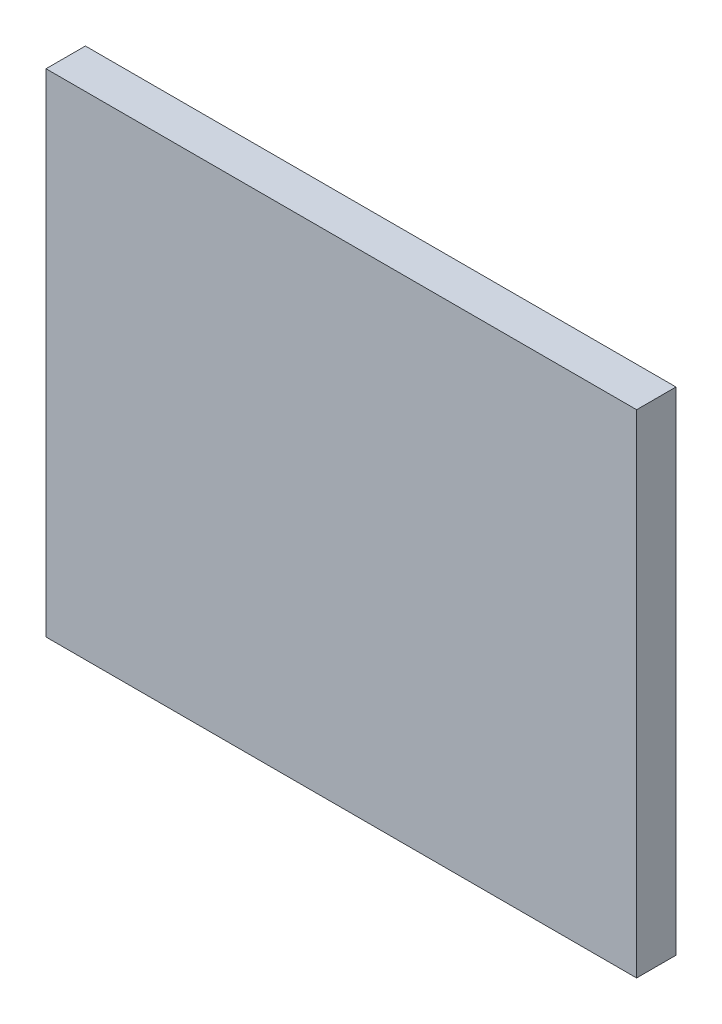
ISO-10303-21;
HEADER;
FILE_DESCRIPTION(('STEP AP214'),'2;1');
FILE_NAME('part.step','',(''),(''),'','','');
FILE_SCHEMA(('AUTOMOTIVE_DESIGN { 1 0 10303 214 1 1 1 1 }'));
ENDSEC;
DATA;
#1=APPLICATION_CONTEXT('core data for automotive mechanical design processes');
#2=APPLICATION_PROTOCOL_DEFINITION('international standard','automotive_design',2000,#1);
#3=PRODUCT_CONTEXT('',#1,'mechanical');
#4=PRODUCT('Part','Part','',(#3));
#5=PRODUCT_RELATED_PRODUCT_CATEGORY('part','',(#4));
#6=PRODUCT_DEFINITION_FORMATION('','',#4);
#7=PRODUCT_DEFINITION_CONTEXT('part definition',#1,'design');
#8=PRODUCT_DEFINITION('design','',#6,#7);
#9=PRODUCT_DEFINITION_SHAPE('','',#8);
#10=(LENGTH_UNIT() NAMED_UNIT(*) SI_UNIT(.MILLI.,.METRE.));
#11=(NAMED_UNIT(*) PLANE_ANGLE_UNIT() SI_UNIT($,.RADIAN.));
#12=(NAMED_UNIT(*) SI_UNIT($,.STERADIAN.) SOLID_ANGLE_UNIT());
#13=UNCERTAINTY_MEASURE_WITH_UNIT(LENGTH_MEASURE(1.E-05),#10,'distance_accuracy_value','');
#14=(GEOMETRIC_REPRESENTATION_CONTEXT(3) GLOBAL_UNCERTAINTY_ASSIGNED_CONTEXT((#13)) GLOBAL_UNIT_ASSIGNED_CONTEXT((#10,
#11,#12)) REPRESENTATION_CONTEXT('',''));
#15=CARTESIAN_POINT('',(0.,0.,0.));
#16=DIRECTION('',(0.,0.,1.));
#17=DIRECTION('',(1.,0.,0.));
#18=AXIS2_PLACEMENT_3D('',#15,#16,#17);
#19=CARTESIAN_POINT('',(150.,-125.,20.));
#20=DIRECTION('',(-1.,0.,0.));
#21=DIRECTION('',(0.,0.,1.));
#22=AXIS2_PLACEMENT_3D('',#19,#20,#21);
#23=PLANE('',#22);
#24=DIRECTION('',(0.,1.,0.));
#25=VECTOR('',#24,1.);
#26=CARTESIAN_POINT('',(150.,-125.,0.));
#27=LINE('',#26,#25);
#28=CARTESIAN_POINT('',(150.,-125.,0.));
#29=VERTEX_POINT('',#28);
#30=CARTESIAN_POINT('',(150.,125.,0.));
#31=VERTEX_POINT('',#30);
#32=EDGE_CURVE('E111',#29,#31,#27,.T.);
#33=ORIENTED_EDGE('',*,*,#32,.T.);
#34=DIRECTION('',(0.,0.,-1.));
#35=VECTOR('',#34,1.);
#36=CARTESIAN_POINT('',(150.,125.,20.));
#37=LINE('',#36,#35);
#38=CARTESIAN_POINT('',(150.,125.,20.));
#39=VERTEX_POINT('',#38);
#40=EDGE_CURVE('E11',#39,#31,#37,.T.);
#41=ORIENTED_EDGE('',*,*,#40,.F.);
#42=DIRECTION('',(0.,1.,0.));
#43=VECTOR('',#42,1.);
#44=CARTESIAN_POINT('',(150.,-125.,20.));
#45=LINE('',#44,#43);
#46=CARTESIAN_POINT('',(150.,-125.,20.));
#47=VERTEX_POINT('',#46);
#48=EDGE_CURVE('E95',#47,#39,#45,.T.);
#49=ORIENTED_EDGE('',*,*,#48,.F.);
#50=DIRECTION('',(0.,0.,-1.));
#51=VECTOR('',#50,1.);
#52=CARTESIAN_POINT('',(150.,-125.,20.));
#53=LINE('',#52,#51);
#54=EDGE_CURVE('E107',#47,#29,#53,.T.);
#55=ORIENTED_EDGE('',*,*,#54,.T.);
#56=EDGE_LOOP('',(#33,#41,#49,#55));
#57=FACE_BOUND('',#56,.T.);
#58=ADVANCED_FACE('F43',(#57),#23,.F.);
#59=CARTESIAN_POINT('',(-150.,125.,20.));
#60=DIRECTION('',(0.,-1.,0.));
#61=DIRECTION('',(0.,0.,-1.));
#62=AXIS2_PLACEMENT_3D('',#59,#60,#61);
#63=PLANE('',#62);
#64=DIRECTION('',(-1.,0.,0.));
#65=VECTOR('',#64,1.);
#66=CARTESIAN_POINT('',(-150.,125.,0.));
#67=LINE('',#66,#65);
#68=CARTESIAN_POINT('',(-150.,125.,0.));
#69=VERTEX_POINT('',#68);
#70=EDGE_CURVE('E100',#31,#69,#67,.T.);
#71=ORIENTED_EDGE('',*,*,#70,.T.);
#72=DIRECTION('',(0.,0.,-1.));
#73=VECTOR('',#72,1.);
#74=CARTESIAN_POINT('',(-150.,125.,20.));
#75=LINE('',#74,#73);
#76=CARTESIAN_POINT('',(-150.,125.,20.));
#77=VERTEX_POINT('',#76);
#78=EDGE_CURVE('E52',#77,#69,#75,.T.);
#79=ORIENTED_EDGE('',*,*,#78,.F.);
#80=DIRECTION('',(-1.,0.,0.));
#81=VECTOR('',#80,1.);
#82=CARTESIAN_POINT('',(-150.,125.,20.));
#83=LINE('',#82,#81);
#84=EDGE_CURVE('E90',#39,#77,#83,.T.);
#85=ORIENTED_EDGE('',*,*,#84,.F.);
#86=ORIENTED_EDGE('',*,*,#40,.T.);
#87=EDGE_LOOP('',(#71,#79,#85,#86));
#88=FACE_BOUND('',#87,.T.);
#89=ADVANCED_FACE('F99',(#88),#63,.F.);
#90=CARTESIAN_POINT('',(-150.,-125.,20.));
#91=DIRECTION('',(1.,0.,0.));
#92=DIRECTION('',(0.,0.,-1.));
#93=AXIS2_PLACEMENT_3D('',#90,#91,#92);
#94=PLANE('',#93);
#95=DIRECTION('',(0.,-1.,0.));
#96=VECTOR('',#95,1.);
#97=CARTESIAN_POINT('',(-150.,-125.,0.));
#98=LINE('',#97,#96);
#99=CARTESIAN_POINT('',(-150.,-125.,0.));
#100=VERTEX_POINT('',#99);
#101=EDGE_CURVE('E77',#69,#100,#98,.T.);
#102=ORIENTED_EDGE('',*,*,#101,.T.);
#103=DIRECTION('',(0.,0.,-1.));
#104=VECTOR('',#103,1.);
#105=CARTESIAN_POINT('',(-150.,-125.,20.));
#106=LINE('',#105,#104);
#107=CARTESIAN_POINT('',(-150.,-125.,20.));
#108=VERTEX_POINT('',#107);
#109=EDGE_CURVE('E102',#108,#100,#106,.T.);
#110=ORIENTED_EDGE('',*,*,#109,.F.);
#111=DIRECTION('',(0.,-1.,0.));
#112=VECTOR('',#111,1.);
#113=CARTESIAN_POINT('',(-150.,-125.,20.));
#114=LINE('',#113,#112);
#115=EDGE_CURVE('E93',#77,#108,#114,.T.);
#116=ORIENTED_EDGE('',*,*,#115,.F.);
#117=ORIENTED_EDGE('',*,*,#78,.T.);
#118=EDGE_LOOP('',(#102,#110,#116,#117));
#119=FACE_BOUND('',#118,.T.);
#120=ADVANCED_FACE('F103',(#119),#94,.F.);
#121=CARTESIAN_POINT('',(-150.,-125.,20.));
#122=DIRECTION('',(0.,1.,0.));
#123=DIRECTION('',(0.,0.,1.));
#124=AXIS2_PLACEMENT_3D('',#121,#122,#123);
#125=PLANE('',#124);
#126=DIRECTION('',(1.,0.,0.));
#127=VECTOR('',#126,1.);
#128=CARTESIAN_POINT('',(-150.,-125.,0.));
#129=LINE('',#128,#127);
#130=EDGE_CURVE('E83',#100,#29,#129,.T.);
#131=ORIENTED_EDGE('',*,*,#130,.T.);
#132=ORIENTED_EDGE('',*,*,#54,.F.);
#133=DIRECTION('',(1.,0.,0.));
#134=VECTOR('',#133,1.);
#135=CARTESIAN_POINT('',(-150.,-125.,20.));
#136=LINE('',#135,#134);
#137=EDGE_CURVE('E60',#108,#47,#136,.T.);
#138=ORIENTED_EDGE('',*,*,#137,.F.);
#139=ORIENTED_EDGE('',*,*,#109,.T.);
#140=EDGE_LOOP('',(#131,#132,#138,#139));
#141=FACE_BOUND('',#140,.T.);
#142=ADVANCED_FACE('F124',(#141),#125,.F.);
#143=CARTESIAN_POINT('',(0.,0.,20.));
#144=DIRECTION('',(0.,0.,-1.));
#145=DIRECTION('',(-1.,0.,0.));
#146=AXIS2_PLACEMENT_3D('',#143,#144,#145);
#147=PLANE('',#146);
#148=ORIENTED_EDGE('',*,*,#48,.T.);
#149=ORIENTED_EDGE('',*,*,#84,.T.);
#150=ORIENTED_EDGE('',*,*,#115,.T.);
#151=ORIENTED_EDGE('',*,*,#137,.T.);
#152=EDGE_LOOP('',(#148,#149,#150,#151));
#153=FACE_BOUND('',#152,.T.);
#154=ADVANCED_FACE('F91',(#153),#147,.F.);
#155=CARTESIAN_POINT('',(0.,0.,0.));
#156=DIRECTION('',(0.,0.,-1.));
#157=DIRECTION('',(-1.,0.,0.));
#158=AXIS2_PLACEMENT_3D('',#155,#156,#157);
#159=PLANE('',#158);
#160=ORIENTED_EDGE('',*,*,#32,.F.);
#161=ORIENTED_EDGE('',*,*,#130,.F.);
#162=ORIENTED_EDGE('',*,*,#101,.F.);
#163=ORIENTED_EDGE('',*,*,#70,.F.);
#164=EDGE_LOOP('',(#160,#161,#162,#163));
#165=FACE_BOUND('',#164,.T.);
#166=ADVANCED_FACE('F127',(#165),#159,.T.);
#167=CLOSED_SHELL('',(#58,#89,#120,#142,#154,#166));
#168=MANIFOLD_SOLID_BREP('B2',#167);
#169=ADVANCED_BREP_SHAPE_REPRESENTATION('',(#18,#168),#14);
#170=SHAPE_DEFINITION_REPRESENTATION(#9,#169);
ENDSEC;
END-ISO-10303-21;
